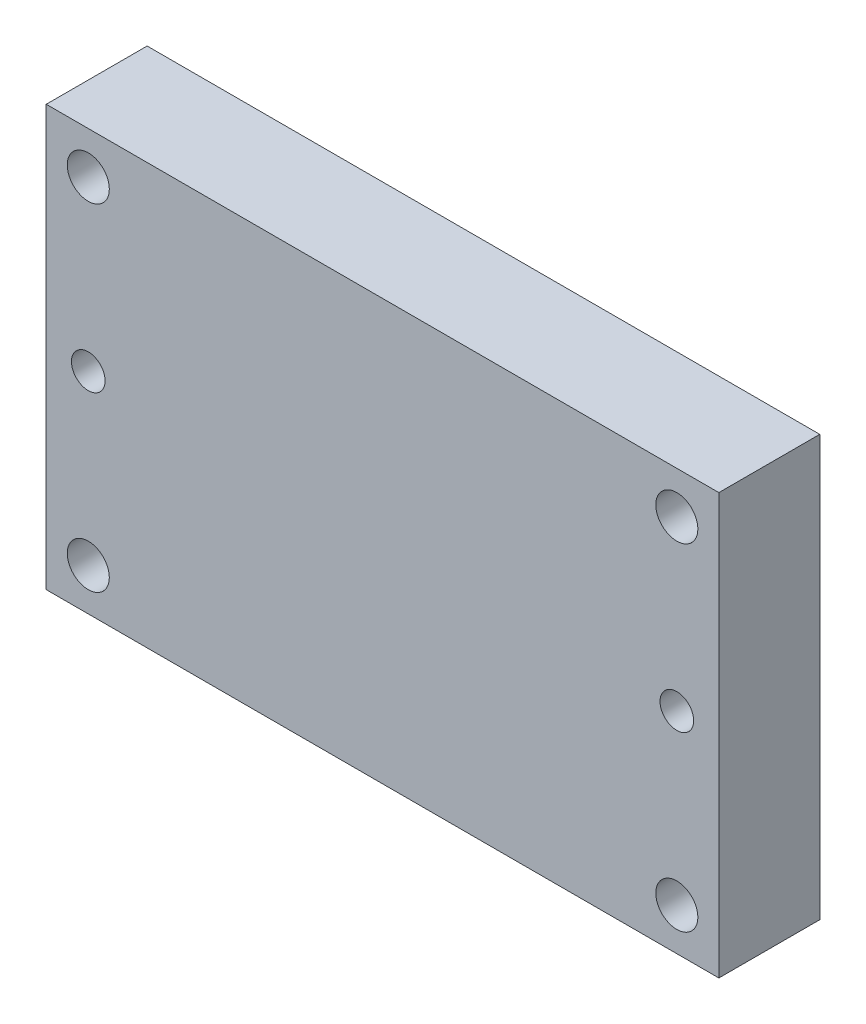
ISO-10303-21;
HEADER;
FILE_DESCRIPTION(('STEP AP214'),'2;1');
FILE_NAME('part.step','',(''),(''),'','','');
FILE_SCHEMA(('AUTOMOTIVE_DESIGN { 1 0 10303 214 1 1 1 1 }'));
ENDSEC;
DATA;
#1=APPLICATION_CONTEXT('core data for automotive mechanical design processes');
#2=APPLICATION_PROTOCOL_DEFINITION('international standard','automotive_design',2000,#1);
#3=PRODUCT_CONTEXT('',#1,'mechanical');
#4=PRODUCT('Part','Part','',(#3));
#5=PRODUCT_RELATED_PRODUCT_CATEGORY('part','',(#4));
#6=PRODUCT_DEFINITION_FORMATION('','',#4);
#7=PRODUCT_DEFINITION_CONTEXT('part definition',#1,'design');
#8=PRODUCT_DEFINITION('design','',#6,#7);
#9=PRODUCT_DEFINITION_SHAPE('','',#8);
#10=(LENGTH_UNIT() NAMED_UNIT(*) SI_UNIT(.MILLI.,.METRE.));
#11=(NAMED_UNIT(*) PLANE_ANGLE_UNIT() SI_UNIT($,.RADIAN.));
#12=(NAMED_UNIT(*) SI_UNIT($,.STERADIAN.) SOLID_ANGLE_UNIT());
#13=UNCERTAINTY_MEASURE_WITH_UNIT(LENGTH_MEASURE(1.E-05),#10,'distance_accuracy_value','');
#14=(GEOMETRIC_REPRESENTATION_CONTEXT(3) GLOBAL_UNCERTAINTY_ASSIGNED_CONTEXT((#13)) GLOBAL_UNIT_ASSIGNED_CONTEXT((#10,
#11,#12)) REPRESENTATION_CONTEXT('',''));
#15=CARTESIAN_POINT('',(0.,0.,0.));
#16=DIRECTION('',(0.,0.,1.));
#17=DIRECTION('',(1.,0.,0.));
#18=AXIS2_PLACEMENT_3D('',#15,#16,#17);
#19=CARTESIAN_POINT('',(35.,20.,0.));
#20=DIRECTION('',(0.,0.,-1.));
#21=DIRECTION('',(1.,0.,0.));
#22=AXIS2_PLACEMENT_3D('',#19,#20,#21);
#23=CYLINDRICAL_SURFACE('',#22,2.5);
#24=CARTESIAN_POINT('',(35.,20.,0.));
#25=DIRECTION('',(0.,0.,1.));
#26=DIRECTION('',(1.,0.,0.));
#27=AXIS2_PLACEMENT_3D('',#24,#25,#26);
#28=CIRCLE('',#27,2.5);
#29=CARTESIAN_POINT('',(37.5,20.,0.));
#30=VERTEX_POINT('',#29);
#31=EDGE_CURVE('E195',#30,#30,#28,.T.);
#32=ORIENTED_EDGE('',*,*,#31,.F.);
#33=DIRECTION('',(0.,0.,1.));
#34=VECTOR('',#33,1.);
#35=CARTESIAN_POINT('',(37.5,20.,0.));
#36=LINE('',#35,#34);
#37=CARTESIAN_POINT('',(37.5,20.,12.));
#38=VERTEX_POINT('',#37);
#39=EDGE_CURVE('E10',#30,#38,#36,.T.);
#40=ORIENTED_EDGE('',*,*,#39,.T.);
#41=CARTESIAN_POINT('',(35.,20.,12.));
#42=DIRECTION('',(0.,0.,-1.));
#43=DIRECTION('',(1.,0.,0.));
#44=AXIS2_PLACEMENT_3D('',#41,#42,#43);
#45=CIRCLE('',#44,2.5);
#46=EDGE_CURVE('E221',#38,#38,#45,.T.);
#47=ORIENTED_EDGE('',*,*,#46,.F.);
#48=ORIENTED_EDGE('',*,*,#39,.F.);
#49=EDGE_LOOP('',(#32,#40,#47,#48));
#50=FACE_BOUND('',#49,.T.);
#51=ADVANCED_FACE('F16',(#50),#23,.F.);
#52=CARTESIAN_POINT('',(35.,0.,0.));
#53=DIRECTION('',(0.,0.,-1.));
#54=DIRECTION('',(1.,0.,0.));
#55=AXIS2_PLACEMENT_3D('',#52,#53,#54);
#56=CYLINDRICAL_SURFACE('',#55,2.);
#57=CARTESIAN_POINT('',(35.,0.,0.));
#58=DIRECTION('',(0.,0.,1.));
#59=DIRECTION('',(1.,0.,0.));
#60=AXIS2_PLACEMENT_3D('',#57,#58,#59);
#61=CIRCLE('',#60,2.);
#62=CARTESIAN_POINT('',(37.,0.,0.));
#63=VERTEX_POINT('',#62);
#64=EDGE_CURVE('E188',#63,#63,#61,.T.);
#65=ORIENTED_EDGE('',*,*,#64,.F.);
#66=DIRECTION('',(0.,0.,1.));
#67=VECTOR('',#66,1.);
#68=CARTESIAN_POINT('',(37.,0.,0.));
#69=LINE('',#68,#67);
#70=CARTESIAN_POINT('',(37.,0.,12.));
#71=VERTEX_POINT('',#70);
#72=EDGE_CURVE('E25',#63,#71,#69,.T.);
#73=ORIENTED_EDGE('',*,*,#72,.T.);
#74=CARTESIAN_POINT('',(35.,0.,12.));
#75=DIRECTION('',(0.,0.,-1.));
#76=DIRECTION('',(1.,0.,0.));
#77=AXIS2_PLACEMENT_3D('',#74,#75,#76);
#78=CIRCLE('',#77,2.);
#79=EDGE_CURVE('E218',#71,#71,#78,.T.);
#80=ORIENTED_EDGE('',*,*,#79,.F.);
#81=ORIENTED_EDGE('',*,*,#72,.F.);
#82=EDGE_LOOP('',(#65,#73,#80,#81));
#83=FACE_BOUND('',#82,.T.);
#84=ADVANCED_FACE('F18',(#83),#56,.F.);
#85=CARTESIAN_POINT('',(-35.,20.,0.));
#86=DIRECTION('',(0.,0.,-1.));
#87=DIRECTION('',(1.,0.,0.));
#88=AXIS2_PLACEMENT_3D('',#85,#86,#87);
#89=CYLINDRICAL_SURFACE('',#88,2.5);
#90=CARTESIAN_POINT('',(-35.,20.,0.));
#91=DIRECTION('',(0.,0.,1.));
#92=DIRECTION('',(1.,0.,0.));
#93=AXIS2_PLACEMENT_3D('',#90,#91,#92);
#94=CIRCLE('',#93,2.5);
#95=CARTESIAN_POINT('',(-32.5,20.,0.));
#96=VERTEX_POINT('',#95);
#97=EDGE_CURVE('E166',#96,#96,#94,.T.);
#98=ORIENTED_EDGE('',*,*,#97,.F.);
#99=DIRECTION('',(0.,0.,1.));
#100=VECTOR('',#99,1.);
#101=CARTESIAN_POINT('',(-32.5,20.,0.));
#102=LINE('',#101,#100);
#103=CARTESIAN_POINT('',(-32.5,20.,12.));
#104=VERTEX_POINT('',#103);
#105=EDGE_CURVE('E228',#96,#104,#102,.T.);
#106=ORIENTED_EDGE('',*,*,#105,.T.);
#107=CARTESIAN_POINT('',(-35.,20.,12.));
#108=DIRECTION('',(0.,0.,-1.));
#109=DIRECTION('',(1.,0.,0.));
#110=AXIS2_PLACEMENT_3D('',#107,#108,#109);
#111=CIRCLE('',#110,2.5);
#112=EDGE_CURVE('E214',#104,#104,#111,.T.);
#113=ORIENTED_EDGE('',*,*,#112,.F.);
#114=ORIENTED_EDGE('',*,*,#105,.F.);
#115=EDGE_LOOP('',(#98,#106,#113,#114));
#116=FACE_BOUND('',#115,.T.);
#117=ADVANCED_FACE('F297',(#116),#89,.F.);
#118=CARTESIAN_POINT('',(-35.,0.,0.));
#119=DIRECTION('',(0.,0.,-1.));
#120=DIRECTION('',(1.,0.,0.));
#121=AXIS2_PLACEMENT_3D('',#118,#119,#120);
#122=CYLINDRICAL_SURFACE('',#121,2.);
#123=CARTESIAN_POINT('',(-35.,0.,0.));
#124=DIRECTION('',(0.,0.,1.));
#125=DIRECTION('',(1.,0.,0.));
#126=AXIS2_PLACEMENT_3D('',#123,#124,#125);
#127=CIRCLE('',#126,2.);
#128=CARTESIAN_POINT('',(-33.,0.,0.));
#129=VERTEX_POINT('',#128);
#130=EDGE_CURVE('E162',#129,#129,#127,.T.);
#131=ORIENTED_EDGE('',*,*,#130,.F.);
#132=DIRECTION('',(0.,0.,1.));
#133=VECTOR('',#132,1.);
#134=CARTESIAN_POINT('',(-33.,0.,0.));
#135=LINE('',#134,#133);
#136=CARTESIAN_POINT('',(-33.,0.,12.));
#137=VERTEX_POINT('',#136);
#138=EDGE_CURVE('E177',#129,#137,#135,.T.);
#139=ORIENTED_EDGE('',*,*,#138,.T.);
#140=CARTESIAN_POINT('',(-35.,0.,12.));
#141=DIRECTION('',(0.,0.,-1.));
#142=DIRECTION('',(1.,0.,0.));
#143=AXIS2_PLACEMENT_3D('',#140,#141,#142);
#144=CIRCLE('',#143,2.);
#145=EDGE_CURVE('E210',#137,#137,#144,.T.);
#146=ORIENTED_EDGE('',*,*,#145,.F.);
#147=ORIENTED_EDGE('',*,*,#138,.F.);
#148=EDGE_LOOP('',(#131,#139,#146,#147));
#149=FACE_BOUND('',#148,.T.);
#150=ADVANCED_FACE('F302',(#149),#122,.F.);
#151=CARTESIAN_POINT('',(35.,-20.,0.));
#152=DIRECTION('',(0.,0.,-1.));
#153=DIRECTION('',(1.,0.,0.));
#154=AXIS2_PLACEMENT_3D('',#151,#152,#153);
#155=CYLINDRICAL_SURFACE('',#154,2.5);
#156=CARTESIAN_POINT('',(35.,-20.,0.));
#157=DIRECTION('',(0.,0.,1.));
#158=DIRECTION('',(1.,0.,0.));
#159=AXIS2_PLACEMENT_3D('',#156,#157,#158);
#160=CIRCLE('',#159,2.5);
#161=CARTESIAN_POINT('',(37.5,-20.,0.));
#162=VERTEX_POINT('',#161);
#163=EDGE_CURVE('E167',#162,#162,#160,.T.);
#164=ORIENTED_EDGE('',*,*,#163,.F.);
#165=DIRECTION('',(0.,0.,1.));
#166=VECTOR('',#165,1.);
#167=CARTESIAN_POINT('',(37.5,-20.,0.));
#168=LINE('',#167,#166);
#169=CARTESIAN_POINT('',(37.5,-20.,12.));
#170=VERTEX_POINT('',#169);
#171=EDGE_CURVE('E174',#162,#170,#168,.T.);
#172=ORIENTED_EDGE('',*,*,#171,.T.);
#173=CARTESIAN_POINT('',(35.,-20.,12.));
#174=DIRECTION('',(0.,0.,-1.));
#175=DIRECTION('',(1.,0.,0.));
#176=AXIS2_PLACEMENT_3D('',#173,#174,#175);
#177=CIRCLE('',#176,2.5);
#178=EDGE_CURVE('E206',#170,#170,#177,.T.);
#179=ORIENTED_EDGE('',*,*,#178,.F.);
#180=ORIENTED_EDGE('',*,*,#171,.F.);
#181=EDGE_LOOP('',(#164,#172,#179,#180));
#182=FACE_BOUND('',#181,.T.);
#183=ADVANCED_FACE('F311',(#182),#155,.F.);
#184=CARTESIAN_POINT('',(-35.,-20.,0.));
#185=DIRECTION('',(0.,0.,-1.));
#186=DIRECTION('',(1.,0.,0.));
#187=AXIS2_PLACEMENT_3D('',#184,#185,#186);
#188=CYLINDRICAL_SURFACE('',#187,2.5);
#189=CARTESIAN_POINT('',(-35.,-20.,0.));
#190=DIRECTION('',(0.,0.,1.));
#191=DIRECTION('',(1.,0.,0.));
#192=AXIS2_PLACEMENT_3D('',#189,#190,#191);
#193=CIRCLE('',#192,2.5);
#194=CARTESIAN_POINT('',(-32.5,-20.,0.));
#195=VERTEX_POINT('',#194);
#196=EDGE_CURVE('E181',#195,#195,#193,.T.);
#197=ORIENTED_EDGE('',*,*,#196,.F.);
#198=DIRECTION('',(0.,0.,1.));
#199=VECTOR('',#198,1.);
#200=CARTESIAN_POINT('',(-32.5,-20.,0.));
#201=LINE('',#200,#199);
#202=CARTESIAN_POINT('',(-32.5,-20.,12.));
#203=VERTEX_POINT('',#202);
#204=EDGE_CURVE('E178',#195,#203,#201,.T.);
#205=ORIENTED_EDGE('',*,*,#204,.T.);
#206=CARTESIAN_POINT('',(-35.,-20.,12.));
#207=DIRECTION('',(0.,0.,-1.));
#208=DIRECTION('',(1.,0.,0.));
#209=AXIS2_PLACEMENT_3D('',#206,#207,#208);
#210=CIRCLE('',#209,2.5);
#211=EDGE_CURVE('E202',#203,#203,#210,.T.);
#212=ORIENTED_EDGE('',*,*,#211,.F.);
#213=ORIENTED_EDGE('',*,*,#204,.F.);
#214=EDGE_LOOP('',(#197,#205,#212,#213));
#215=FACE_BOUND('',#214,.T.);
#216=ADVANCED_FACE('F276',(#215),#188,.F.);
#217=CARTESIAN_POINT('',(40.,25.,0.));
#218=DIRECTION('',(0.,-1.,0.));
#219=DIRECTION('',(0.,0.,-1.));
#220=AXIS2_PLACEMENT_3D('',#217,#218,#219);
#221=PLANE('',#220);
#222=DIRECTION('',(-1.,0.,0.));
#223=VECTOR('',#222,1.);
#224=CARTESIAN_POINT('',(40.,25.,0.));
#225=LINE('',#224,#223);
#226=CARTESIAN_POINT('',(40.,25.,0.));
#227=VERTEX_POINT('',#226);
#228=CARTESIAN_POINT('',(-40.,25.,0.));
#229=VERTEX_POINT('',#228);
#230=EDGE_CURVE('E131',#227,#229,#225,.T.);
#231=ORIENTED_EDGE('',*,*,#230,.T.);
#232=DIRECTION('',(0.,0.,1.));
#233=VECTOR('',#232,1.);
#234=CARTESIAN_POINT('',(-40.,25.,0.));
#235=LINE('',#234,#233);
#236=CARTESIAN_POINT('',(-40.,25.,12.));
#237=VERTEX_POINT('',#236);
#238=EDGE_CURVE('E155',#229,#237,#235,.T.);
#239=ORIENTED_EDGE('',*,*,#238,.T.);
#240=DIRECTION('',(-1.,0.,0.));
#241=VECTOR('',#240,1.);
#242=CARTESIAN_POINT('',(40.,25.,12.));
#243=LINE('',#242,#241);
#244=CARTESIAN_POINT('',(40.,25.,12.));
#245=VERTEX_POINT('',#244);
#246=EDGE_CURVE('E199',#245,#237,#243,.T.);
#247=ORIENTED_EDGE('',*,*,#246,.F.);
#248=DIRECTION('',(0.,0.,1.));
#249=VECTOR('',#248,1.);
#250=CARTESIAN_POINT('',(40.,25.,0.));
#251=LINE('',#250,#249);
#252=EDGE_CURVE('E128',#227,#245,#251,.T.);
#253=ORIENTED_EDGE('',*,*,#252,.F.);
#254=EDGE_LOOP('',(#231,#239,#247,#253));
#255=FACE_BOUND('',#254,.T.);
#256=ADVANCED_FACE('F271',(#255),#221,.F.);
#257=CARTESIAN_POINT('',(0.,0.,12.));
#258=DIRECTION('',(0.,0.,1.));
#259=DIRECTION('',(1.,0.,0.));
#260=AXIS2_PLACEMENT_3D('',#257,#258,#259);
#261=PLANE('',#260);
#262=ORIENTED_EDGE('',*,*,#46,.T.);
#263=EDGE_LOOP('',(#262));
#264=FACE_BOUND('',#263,.T.);
#265=ORIENTED_EDGE('',*,*,#79,.T.);
#266=EDGE_LOOP('',(#265));
#267=FACE_BOUND('',#266,.T.);
#268=ORIENTED_EDGE('',*,*,#112,.T.);
#269=EDGE_LOOP('',(#268));
#270=FACE_BOUND('',#269,.T.);
#271=ORIENTED_EDGE('',*,*,#145,.T.);
#272=EDGE_LOOP('',(#271));
#273=FACE_BOUND('',#272,.T.);
#274=ORIENTED_EDGE('',*,*,#178,.T.);
#275=EDGE_LOOP('',(#274));
#276=FACE_BOUND('',#275,.T.);
#277=ORIENTED_EDGE('',*,*,#211,.T.);
#278=EDGE_LOOP('',(#277));
#279=FACE_BOUND('',#278,.T.);
#280=DIRECTION('',(1.,0.,0.));
#281=VECTOR('',#280,1.);
#282=CARTESIAN_POINT('',(-40.,-25.,12.));
#283=LINE('',#282,#281);
#284=CARTESIAN_POINT('',(-40.,-25.,12.));
#285=VERTEX_POINT('',#284);
#286=CARTESIAN_POINT('',(40.,-25.,12.));
#287=VERTEX_POINT('',#286);
#288=EDGE_CURVE('E134',#285,#287,#283,.T.);
#289=ORIENTED_EDGE('',*,*,#288,.T.);
#290=DIRECTION('',(0.,1.,0.));
#291=VECTOR('',#290,1.);
#292=CARTESIAN_POINT('',(40.,-25.,12.));
#293=LINE('',#292,#291);
#294=EDGE_CURVE('E120',#287,#245,#293,.T.);
#295=ORIENTED_EDGE('',*,*,#294,.T.);
#296=ORIENTED_EDGE('',*,*,#246,.T.);
#297=DIRECTION('',(0.,-1.,0.));
#298=VECTOR('',#297,1.);
#299=CARTESIAN_POINT('',(-40.,25.,12.));
#300=LINE('',#299,#298);
#301=EDGE_CURVE('E137',#237,#285,#300,.T.);
#302=ORIENTED_EDGE('',*,*,#301,.T.);
#303=EDGE_LOOP('',(#289,#295,#296,#302));
#304=FACE_BOUND('',#303,.T.);
#305=ADVANCED_FACE('F135',(#264,#267,#270,#273,#276,#279,#304),#261,.T.);
#306=CARTESIAN_POINT('',(0.,0.,0.));
#307=DIRECTION('',(0.,0.,1.));
#308=DIRECTION('',(1.,0.,0.));
#309=AXIS2_PLACEMENT_3D('',#306,#307,#308);
#310=PLANE('',#309);
#311=ORIENTED_EDGE('',*,*,#31,.T.);
#312=EDGE_LOOP('',(#311));
#313=FACE_BOUND('',#312,.T.);
#314=ORIENTED_EDGE('',*,*,#64,.T.);
#315=EDGE_LOOP('',(#314));
#316=FACE_BOUND('',#315,.T.);
#317=ORIENTED_EDGE('',*,*,#97,.T.);
#318=EDGE_LOOP('',(#317));
#319=FACE_BOUND('',#318,.T.);
#320=ORIENTED_EDGE('',*,*,#130,.T.);
#321=EDGE_LOOP('',(#320));
#322=FACE_BOUND('',#321,.T.);
#323=ORIENTED_EDGE('',*,*,#163,.T.);
#324=EDGE_LOOP('',(#323));
#325=FACE_BOUND('',#324,.T.);
#326=ORIENTED_EDGE('',*,*,#196,.T.);
#327=EDGE_LOOP('',(#326));
#328=FACE_BOUND('',#327,.T.);
#329=DIRECTION('',(0.,-1.,0.));
#330=VECTOR('',#329,1.);
#331=CARTESIAN_POINT('',(-40.,25.,0.));
#332=LINE('',#331,#330);
#333=CARTESIAN_POINT('',(-40.,-25.,0.));
#334=VERTEX_POINT('',#333);
#335=EDGE_CURVE('E160',#229,#334,#332,.T.);
#336=ORIENTED_EDGE('',*,*,#335,.F.);
#337=ORIENTED_EDGE('',*,*,#230,.F.);
#338=DIRECTION('',(0.,1.,0.));
#339=VECTOR('',#338,1.);
#340=CARTESIAN_POINT('',(40.,-25.,0.));
#341=LINE('',#340,#339);
#342=CARTESIAN_POINT('',(40.,-25.,0.));
#343=VERTEX_POINT('',#342);
#344=EDGE_CURVE('E158',#343,#227,#341,.T.);
#345=ORIENTED_EDGE('',*,*,#344,.F.);
#346=DIRECTION('',(1.,0.,0.));
#347=VECTOR('',#346,1.);
#348=CARTESIAN_POINT('',(-40.,-25.,0.));
#349=LINE('',#348,#347);
#350=EDGE_CURVE('E146',#334,#343,#349,.T.);
#351=ORIENTED_EDGE('',*,*,#350,.F.);
#352=EDGE_LOOP('',(#336,#337,#345,#351));
#353=FACE_BOUND('',#352,.T.);
#354=ADVANCED_FACE('F266',(#313,#316,#319,#322,#325,#328,#353),#310,.F.);
#355=CARTESIAN_POINT('',(40.,-25.,0.));
#356=DIRECTION('',(-1.,0.,0.));
#357=DIRECTION('',(0.,0.,1.));
#358=AXIS2_PLACEMENT_3D('',#355,#356,#357);
#359=PLANE('',#358);
#360=ORIENTED_EDGE('',*,*,#344,.T.);
#361=ORIENTED_EDGE('',*,*,#252,.T.);
#362=ORIENTED_EDGE('',*,*,#294,.F.);
#363=DIRECTION('',(0.,0.,1.));
#364=VECTOR('',#363,1.);
#365=CARTESIAN_POINT('',(40.,-25.,0.));
#366=LINE('',#365,#364);
#367=EDGE_CURVE('E125',#343,#287,#366,.T.);
#368=ORIENTED_EDGE('',*,*,#367,.F.);
#369=EDGE_LOOP('',(#360,#361,#362,#368));
#370=FACE_BOUND('',#369,.T.);
#371=ADVANCED_FACE('F123',(#370),#359,.F.);
#372=CARTESIAN_POINT('',(-40.,25.,0.));
#373=DIRECTION('',(1.,0.,0.));
#374=DIRECTION('',(0.,1.,0.));
#375=AXIS2_PLACEMENT_3D('',#372,#373,#374);
#376=PLANE('',#375);
#377=ORIENTED_EDGE('',*,*,#335,.T.);
#378=DIRECTION('',(0.,0.,1.));
#379=VECTOR('',#378,1.);
#380=CARTESIAN_POINT('',(-40.,-25.,0.));
#381=LINE('',#380,#379);
#382=EDGE_CURVE('E142',#334,#285,#381,.T.);
#383=ORIENTED_EDGE('',*,*,#382,.T.);
#384=ORIENTED_EDGE('',*,*,#301,.F.);
#385=ORIENTED_EDGE('',*,*,#238,.F.);
#386=EDGE_LOOP('',(#377,#383,#384,#385));
#387=FACE_BOUND('',#386,.T.);
#388=ADVANCED_FACE('F241',(#387),#376,.F.);
#389=CARTESIAN_POINT('',(-40.,-25.,0.));
#390=DIRECTION('',(0.,1.,0.));
#391=DIRECTION('',(1.,0.,0.));
#392=AXIS2_PLACEMENT_3D('',#389,#390,#391);
#393=PLANE('',#392);
#394=ORIENTED_EDGE('',*,*,#350,.T.);
#395=ORIENTED_EDGE('',*,*,#367,.T.);
#396=ORIENTED_EDGE('',*,*,#288,.F.);
#397=ORIENTED_EDGE('',*,*,#382,.F.);
#398=EDGE_LOOP('',(#394,#395,#396,#397));
#399=FACE_BOUND('',#398,.T.);
#400=ADVANCED_FACE('F144',(#399),#393,.F.);
#401=CLOSED_SHELL('',(#51,#84,#117,#150,#183,#216,#256,#305,#354,#371,#388,#400));
#402=MANIFOLD_SOLID_BREP('B1',#401);
#403=ADVANCED_BREP_SHAPE_REPRESENTATION('',(#18,#402),#14);
#404=SHAPE_DEFINITION_REPRESENTATION(#9,#403);
ENDSEC;
END-ISO-10303-21;
